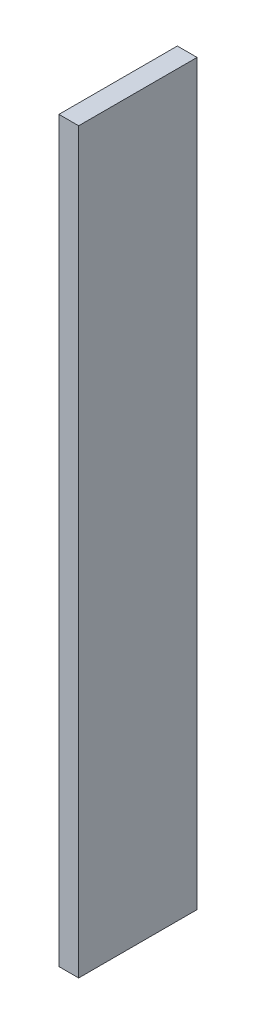
ISO-10303-21;
HEADER;
FILE_DESCRIPTION(('STEP AP214'),'2;1');
FILE_NAME('part.step','',(''),(''),'','','');
FILE_SCHEMA(('AUTOMOTIVE_DESIGN { 1 0 10303 214 1 1 1 1 }'));
ENDSEC;
DATA;
#1=APPLICATION_CONTEXT('core data for automotive mechanical design processes');
#2=APPLICATION_PROTOCOL_DEFINITION('international standard','automotive_design',2000,#1);
#3=PRODUCT_CONTEXT('',#1,'mechanical');
#4=PRODUCT('Part','Part','',(#3));
#5=PRODUCT_RELATED_PRODUCT_CATEGORY('part','',(#4));
#6=PRODUCT_DEFINITION_FORMATION('','',#4);
#7=PRODUCT_DEFINITION_CONTEXT('part definition',#1,'design');
#8=PRODUCT_DEFINITION('design','',#6,#7);
#9=PRODUCT_DEFINITION_SHAPE('','',#8);
#10=(LENGTH_UNIT() NAMED_UNIT(*) SI_UNIT(.MILLI.,.METRE.));
#11=(NAMED_UNIT(*) PLANE_ANGLE_UNIT() SI_UNIT($,.RADIAN.));
#12=(NAMED_UNIT(*) SI_UNIT($,.STERADIAN.) SOLID_ANGLE_UNIT());
#13=UNCERTAINTY_MEASURE_WITH_UNIT(LENGTH_MEASURE(1.E-05),#10,'distance_accuracy_value','');
#14=(GEOMETRIC_REPRESENTATION_CONTEXT(3) GLOBAL_UNCERTAINTY_ASSIGNED_CONTEXT((#13)) GLOBAL_UNIT_ASSIGNED_CONTEXT((#10,
#11,#12)) REPRESENTATION_CONTEXT('',''));
#15=CARTESIAN_POINT('',(0.,0.,0.));
#16=DIRECTION('',(0.,0.,1.));
#17=DIRECTION('',(1.,0.,0.));
#18=AXIS2_PLACEMENT_3D('',#15,#16,#17);
#19=CARTESIAN_POINT('',(0.,187.,0.));
#20=DIRECTION('',(1.,0.,0.));
#21=DIRECTION('',(0.,0.,-1.));
#22=AXIS2_PLACEMENT_3D('',#19,#20,#21);
#23=PLANE('',#22);
#24=DIRECTION('',(0.,0.,1.));
#25=VECTOR('',#24,1.);
#26=CARTESIAN_POINT('',(0.,0.,0.));
#27=LINE('',#26,#25);
#28=CARTESIAN_POINT('',(0.,0.,0.));
#29=VERTEX_POINT('',#28);
#30=CARTESIAN_POINT('',(0.,0.,30.));
#31=VERTEX_POINT('',#30);
#32=EDGE_CURVE('E98',#29,#31,#27,.T.);
#33=ORIENTED_EDGE('',*,*,#32,.T.);
#34=DIRECTION('',(0.,-1.,0.));
#35=VECTOR('',#34,1.);
#36=CARTESIAN_POINT('',(0.,187.,30.));
#37=LINE('',#36,#35);
#38=CARTESIAN_POINT('',(0.,187.,30.));
#39=VERTEX_POINT('',#38);
#40=EDGE_CURVE('E11',#39,#31,#37,.T.);
#41=ORIENTED_EDGE('',*,*,#40,.F.);
#42=DIRECTION('',(0.,0.,1.));
#43=VECTOR('',#42,1.);
#44=CARTESIAN_POINT('',(0.,187.,0.));
#45=LINE('',#44,#43);
#46=CARTESIAN_POINT('',(0.,187.,0.));
#47=VERTEX_POINT('',#46);
#48=EDGE_CURVE('E86',#47,#39,#45,.T.);
#49=ORIENTED_EDGE('',*,*,#48,.F.);
#50=DIRECTION('',(0.,-1.,0.));
#51=VECTOR('',#50,1.);
#52=CARTESIAN_POINT('',(0.,187.,0.));
#53=LINE('',#52,#51);
#54=EDGE_CURVE('E94',#47,#29,#53,.T.);
#55=ORIENTED_EDGE('',*,*,#54,.T.);
#56=EDGE_LOOP('',(#33,#41,#49,#55));
#57=FACE_BOUND('',#56,.T.);
#58=ADVANCED_FACE('F35',(#57),#23,.F.);
#59=CARTESIAN_POINT('',(0.,187.,30.));
#60=DIRECTION('',(0.,0.,-1.));
#61=DIRECTION('',(-1.,0.,0.));
#62=AXIS2_PLACEMENT_3D('',#59,#60,#61);
#63=PLANE('',#62);
#64=DIRECTION('',(1.,0.,0.));
#65=VECTOR('',#64,1.);
#66=CARTESIAN_POINT('',(0.,0.,30.));
#67=LINE('',#66,#65);
#68=CARTESIAN_POINT('',(5.,0.,30.));
#69=VERTEX_POINT('',#68);
#70=EDGE_CURVE('E90',#31,#69,#67,.T.);
#71=ORIENTED_EDGE('',*,*,#70,.T.);
#72=DIRECTION('',(0.,-1.,0.));
#73=VECTOR('',#72,1.);
#74=CARTESIAN_POINT('',(5.,187.,30.));
#75=LINE('',#74,#73);
#76=CARTESIAN_POINT('',(5.,187.,30.));
#77=VERTEX_POINT('',#76);
#78=EDGE_CURVE('E43',#77,#69,#75,.T.);
#79=ORIENTED_EDGE('',*,*,#78,.F.);
#80=DIRECTION('',(1.,0.,0.));
#81=VECTOR('',#80,1.);
#82=CARTESIAN_POINT('',(0.,187.,30.));
#83=LINE('',#82,#81);
#84=EDGE_CURVE('E81',#39,#77,#83,.T.);
#85=ORIENTED_EDGE('',*,*,#84,.F.);
#86=ORIENTED_EDGE('',*,*,#40,.T.);
#87=EDGE_LOOP('',(#71,#79,#85,#86));
#88=FACE_BOUND('',#87,.T.);
#89=ADVANCED_FACE('F89',(#88),#63,.F.);
#90=CARTESIAN_POINT('',(5.,187.,0.));
#91=DIRECTION('',(-1.,0.,0.));
#92=DIRECTION('',(0.,0.,1.));
#93=AXIS2_PLACEMENT_3D('',#90,#91,#92);
#94=PLANE('',#93);
#95=DIRECTION('',(0.,0.,-1.));
#96=VECTOR('',#95,1.);
#97=CARTESIAN_POINT('',(5.,0.,0.));
#98=LINE('',#97,#96);
#99=CARTESIAN_POINT('',(5.,0.,0.));
#100=VERTEX_POINT('',#99);
#101=EDGE_CURVE('E68',#69,#100,#98,.T.);
#102=ORIENTED_EDGE('',*,*,#101,.T.);
#103=DIRECTION('',(0.,-1.,0.));
#104=VECTOR('',#103,1.);
#105=CARTESIAN_POINT('',(5.,187.,0.));
#106=LINE('',#105,#104);
#107=CARTESIAN_POINT('',(5.,187.,0.));
#108=VERTEX_POINT('',#107);
#109=EDGE_CURVE('E91',#108,#100,#106,.T.);
#110=ORIENTED_EDGE('',*,*,#109,.F.);
#111=DIRECTION('',(0.,0.,-1.));
#112=VECTOR('',#111,1.);
#113=CARTESIAN_POINT('',(5.,187.,0.));
#114=LINE('',#113,#112);
#115=EDGE_CURVE('E84',#77,#108,#114,.T.);
#116=ORIENTED_EDGE('',*,*,#115,.F.);
#117=ORIENTED_EDGE('',*,*,#78,.T.);
#118=EDGE_LOOP('',(#102,#110,#116,#117));
#119=FACE_BOUND('',#118,.T.);
#120=ADVANCED_FACE('F92',(#119),#94,.F.);
#121=CARTESIAN_POINT('',(0.,187.,0.));
#122=DIRECTION('',(0.,0.,1.));
#123=DIRECTION('',(1.,0.,0.));
#124=AXIS2_PLACEMENT_3D('',#121,#122,#123);
#125=PLANE('',#124);
#126=DIRECTION('',(-1.,0.,0.));
#127=VECTOR('',#126,1.);
#128=CARTESIAN_POINT('',(0.,0.,0.));
#129=LINE('',#128,#127);
#130=EDGE_CURVE('E74',#100,#29,#129,.T.);
#131=ORIENTED_EDGE('',*,*,#130,.T.);
#132=ORIENTED_EDGE('',*,*,#54,.F.);
#133=DIRECTION('',(-1.,0.,0.));
#134=VECTOR('',#133,1.);
#135=CARTESIAN_POINT('',(0.,187.,0.));
#136=LINE('',#135,#134);
#137=EDGE_CURVE('E51',#108,#47,#136,.T.);
#138=ORIENTED_EDGE('',*,*,#137,.F.);
#139=ORIENTED_EDGE('',*,*,#109,.T.);
#140=EDGE_LOOP('',(#131,#132,#138,#139));
#141=FACE_BOUND('',#140,.T.);
#142=ADVANCED_FACE('F105',(#141),#125,.F.);
#143=CARTESIAN_POINT('',(0.,187.,0.));
#144=DIRECTION('',(0.,1.,0.));
#145=DIRECTION('',(0.,0.,1.));
#146=AXIS2_PLACEMENT_3D('',#143,#144,#145);
#147=PLANE('',#146);
#148=ORIENTED_EDGE('',*,*,#48,.T.);
#149=ORIENTED_EDGE('',*,*,#84,.T.);
#150=ORIENTED_EDGE('',*,*,#115,.T.);
#151=ORIENTED_EDGE('',*,*,#137,.T.);
#152=EDGE_LOOP('',(#148,#149,#150,#151));
#153=FACE_BOUND('',#152,.T.);
#154=ADVANCED_FACE('F82',(#153),#147,.T.);
#155=CARTESIAN_POINT('',(0.,0.,0.));
#156=DIRECTION('',(0.,1.,0.));
#157=DIRECTION('',(0.,0.,1.));
#158=AXIS2_PLACEMENT_3D('',#155,#156,#157);
#159=PLANE('',#158);
#160=ORIENTED_EDGE('',*,*,#32,.F.);
#161=ORIENTED_EDGE('',*,*,#130,.F.);
#162=ORIENTED_EDGE('',*,*,#101,.F.);
#163=ORIENTED_EDGE('',*,*,#70,.F.);
#164=EDGE_LOOP('',(#160,#161,#162,#163));
#165=FACE_BOUND('',#164,.T.);
#166=ADVANCED_FACE('F108',(#165),#159,.F.);
#167=CLOSED_SHELL('',(#58,#89,#120,#142,#154,#166));
#168=MANIFOLD_SOLID_BREP('B2',#167);
#169=ADVANCED_BREP_SHAPE_REPRESENTATION('',(#18,#168),#14);
#170=SHAPE_DEFINITION_REPRESENTATION(#9,#169);
ENDSEC;
END-ISO-10303-21;
